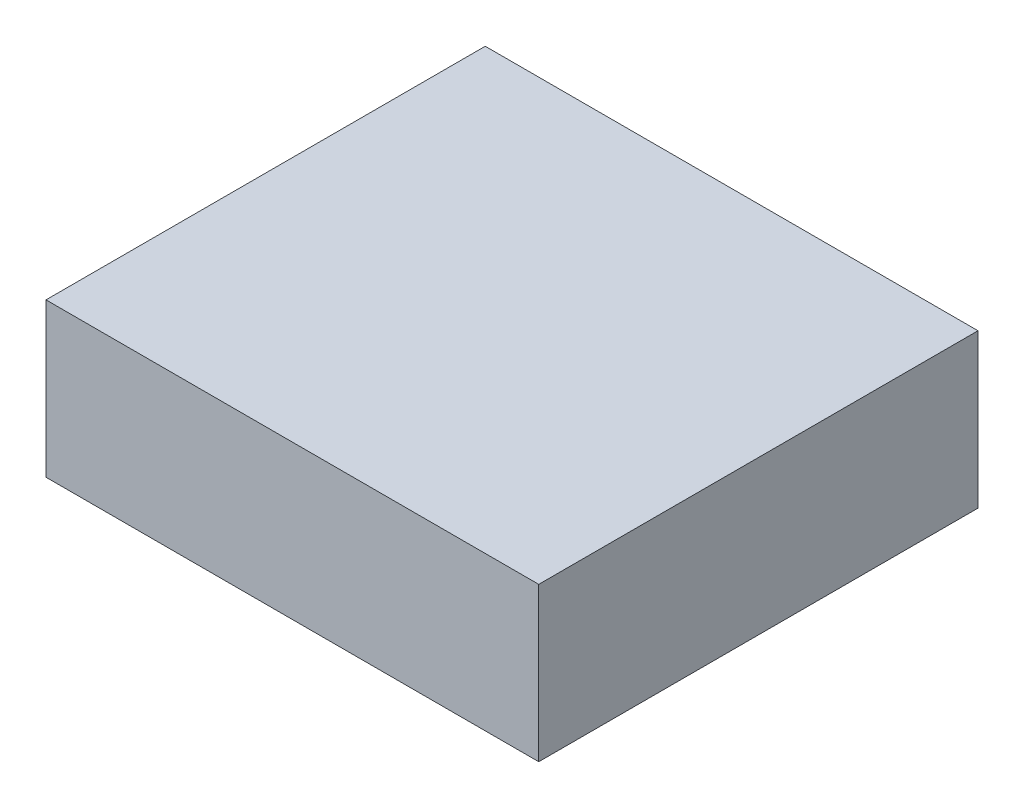
ISO-10303-21;
HEADER;
FILE_DESCRIPTION(('STEP AP214'),'2;1');
FILE_NAME('part.step','',(''),(''),'','','');
FILE_SCHEMA(('AUTOMOTIVE_DESIGN { 1 0 10303 214 1 1 1 1 }'));
ENDSEC;
DATA;
#1=APPLICATION_CONTEXT('core data for automotive mechanical design processes');
#2=APPLICATION_PROTOCOL_DEFINITION('international standard','automotive_design',2000,#1);
#3=PRODUCT_CONTEXT('',#1,'mechanical');
#4=PRODUCT('Part','Part','',(#3));
#5=PRODUCT_RELATED_PRODUCT_CATEGORY('part','',(#4));
#6=PRODUCT_DEFINITION_FORMATION('','',#4);
#7=PRODUCT_DEFINITION_CONTEXT('part definition',#1,'design');
#8=PRODUCT_DEFINITION('design','',#6,#7);
#9=PRODUCT_DEFINITION_SHAPE('','',#8);
#10=(LENGTH_UNIT() NAMED_UNIT(*) SI_UNIT(.MILLI.,.METRE.));
#11=(NAMED_UNIT(*) PLANE_ANGLE_UNIT() SI_UNIT($,.RADIAN.));
#12=(NAMED_UNIT(*) SI_UNIT($,.STERADIAN.) SOLID_ANGLE_UNIT());
#13=UNCERTAINTY_MEASURE_WITH_UNIT(LENGTH_MEASURE(1.E-05),#10,'distance_accuracy_value','');
#14=(GEOMETRIC_REPRESENTATION_CONTEXT(3) GLOBAL_UNCERTAINTY_ASSIGNED_CONTEXT((#13)) GLOBAL_UNIT_ASSIGNED_CONTEXT((#10,
#11,#12)) REPRESENTATION_CONTEXT('',''));
#15=CARTESIAN_POINT('',(0.,0.,0.));
#16=DIRECTION('',(0.,0.,1.));
#17=DIRECTION('',(1.,0.,0.));
#18=AXIS2_PLACEMENT_3D('',#15,#16,#17);
#19=CARTESIAN_POINT('',(-62.4778997860176,39.624,-63.9370439423789));
#20=DIRECTION('',(1.,0.,0.));
#21=DIRECTION('',(0.,0.,-1.));
#22=AXIS2_PLACEMENT_3D('',#19,#20,#21);
#23=PLANE('',#22);
#24=DIRECTION('',(0.,0.,1.));
#25=VECTOR('',#24,1.);
#26=CARTESIAN_POINT('',(-62.4778997860176,0.,-63.9370439423789));
#27=LINE('',#26,#25);
#28=CARTESIAN_POINT('',(-62.4778997860176,0.,-63.9370439423789));
#29=VERTEX_POINT('',#28);
#30=CARTESIAN_POINT('',(-62.4778997860176,0.,49.3456023787655));
#31=VERTEX_POINT('',#30);
#32=EDGE_CURVE('E100',#29,#31,#27,.T.);
#33=ORIENTED_EDGE('',*,*,#32,.T.);
#34=DIRECTION('',(0.,-1.,0.));
#35=VECTOR('',#34,1.);
#36=CARTESIAN_POINT('',(-62.4778997860176,39.624,49.3456023787655));
#37=LINE('',#36,#35);
#38=CARTESIAN_POINT('',(-62.4778997860176,39.624,49.3456023787655));
#39=VERTEX_POINT('',#38);
#40=EDGE_CURVE('E11',#39,#31,#37,.T.);
#41=ORIENTED_EDGE('',*,*,#40,.F.);
#42=DIRECTION('',(0.,0.,1.));
#43=VECTOR('',#42,1.);
#44=CARTESIAN_POINT('',(-62.4778997860176,39.624,-63.9370439423789));
#45=LINE('',#44,#43);
#46=CARTESIAN_POINT('',(-62.4778997860176,39.624,-63.9370439423789));
#47=VERTEX_POINT('',#46);
#48=EDGE_CURVE('E88',#47,#39,#45,.T.);
#49=ORIENTED_EDGE('',*,*,#48,.F.);
#50=DIRECTION('',(0.,-1.,0.));
#51=VECTOR('',#50,1.);
#52=CARTESIAN_POINT('',(-62.4778997860176,39.624,-63.9370439423789));
#53=LINE('',#52,#51);
#54=EDGE_CURVE('E96',#47,#29,#53,.T.);
#55=ORIENTED_EDGE('',*,*,#54,.T.);
#56=EDGE_LOOP('',(#33,#41,#49,#55));
#57=FACE_BOUND('',#56,.T.);
#58=ADVANCED_FACE('F37',(#57),#23,.F.);
#59=CARTESIAN_POINT('',(-62.4778997860176,39.624,49.3456023787655));
#60=DIRECTION('',(0.,0.,-1.));
#61=DIRECTION('',(-1.,0.,0.));
#62=AXIS2_PLACEMENT_3D('',#59,#60,#61);
#63=PLANE('',#62);
#64=DIRECTION('',(1.,0.,0.));
#65=VECTOR('',#64,1.);
#66=CARTESIAN_POINT('',(-62.4778997860176,0.,49.3456023787655));
#67=LINE('',#66,#65);
#68=CARTESIAN_POINT('',(64.6002912861796,0.,49.3456023787655));
#69=VERTEX_POINT('',#68);
#70=EDGE_CURVE('E92',#31,#69,#67,.T.);
#71=ORIENTED_EDGE('',*,*,#70,.T.);
#72=DIRECTION('',(0.,-1.,0.));
#73=VECTOR('',#72,1.);
#74=CARTESIAN_POINT('',(64.6002912861796,39.624,49.3456023787655));
#75=LINE('',#74,#73);
#76=CARTESIAN_POINT('',(64.6002912861796,39.624,49.3456023787655));
#77=VERTEX_POINT('',#76);
#78=EDGE_CURVE('E45',#77,#69,#75,.T.);
#79=ORIENTED_EDGE('',*,*,#78,.F.);
#80=DIRECTION('',(1.,0.,0.));
#81=VECTOR('',#80,1.);
#82=CARTESIAN_POINT('',(-62.4778997860176,39.624,49.3456023787655));
#83=LINE('',#82,#81);
#84=EDGE_CURVE('E83',#39,#77,#83,.T.);
#85=ORIENTED_EDGE('',*,*,#84,.F.);
#86=ORIENTED_EDGE('',*,*,#40,.T.);
#87=EDGE_LOOP('',(#71,#79,#85,#86));
#88=FACE_BOUND('',#87,.T.);
#89=ADVANCED_FACE('F91',(#88),#63,.F.);
#90=CARTESIAN_POINT('',(64.6002912861796,39.624,-63.9370439423789));
#91=DIRECTION('',(-1.,0.,0.));
#92=DIRECTION('',(0.,0.,1.));
#93=AXIS2_PLACEMENT_3D('',#90,#91,#92);
#94=PLANE('',#93);
#95=DIRECTION('',(0.,0.,-1.));
#96=VECTOR('',#95,1.);
#97=CARTESIAN_POINT('',(64.6002912861796,0.,-63.9370439423789));
#98=LINE('',#97,#96);
#99=CARTESIAN_POINT('',(64.6002912861796,0.,-63.9370439423789));
#100=VERTEX_POINT('',#99);
#101=EDGE_CURVE('E70',#69,#100,#98,.T.);
#102=ORIENTED_EDGE('',*,*,#101,.T.);
#103=DIRECTION('',(0.,-1.,0.));
#104=VECTOR('',#103,1.);
#105=CARTESIAN_POINT('',(64.6002912861796,39.624,-63.9370439423789));
#106=LINE('',#105,#104);
#107=CARTESIAN_POINT('',(64.6002912861796,39.624,-63.9370439423789));
#108=VERTEX_POINT('',#107);
#109=EDGE_CURVE('E93',#108,#100,#106,.T.);
#110=ORIENTED_EDGE('',*,*,#109,.F.);
#111=DIRECTION('',(0.,0.,-1.));
#112=VECTOR('',#111,1.);
#113=CARTESIAN_POINT('',(64.6002912861796,39.624,-63.9370439423789));
#114=LINE('',#113,#112);
#115=EDGE_CURVE('E86',#77,#108,#114,.T.);
#116=ORIENTED_EDGE('',*,*,#115,.F.);
#117=ORIENTED_EDGE('',*,*,#78,.T.);
#118=EDGE_LOOP('',(#102,#110,#116,#117));
#119=FACE_BOUND('',#118,.T.);
#120=ADVANCED_FACE('F94',(#119),#94,.F.);
#121=CARTESIAN_POINT('',(-62.4778997860176,39.624,-63.9370439423789));
#122=DIRECTION('',(0.,0.,1.));
#123=DIRECTION('',(1.,0.,0.));
#124=AXIS2_PLACEMENT_3D('',#121,#122,#123);
#125=PLANE('',#124);
#126=DIRECTION('',(-1.,0.,0.));
#127=VECTOR('',#126,1.);
#128=CARTESIAN_POINT('',(-62.4778997860176,0.,-63.9370439423789));
#129=LINE('',#128,#127);
#130=EDGE_CURVE('E76',#100,#29,#129,.T.);
#131=ORIENTED_EDGE('',*,*,#130,.T.);
#132=ORIENTED_EDGE('',*,*,#54,.F.);
#133=DIRECTION('',(-1.,0.,0.));
#134=VECTOR('',#133,1.);
#135=CARTESIAN_POINT('',(-62.4778997860176,39.624,-63.9370439423789));
#136=LINE('',#135,#134);
#137=EDGE_CURVE('E53',#108,#47,#136,.T.);
#138=ORIENTED_EDGE('',*,*,#137,.F.);
#139=ORIENTED_EDGE('',*,*,#109,.T.);
#140=EDGE_LOOP('',(#131,#132,#138,#139));
#141=FACE_BOUND('',#140,.T.);
#142=ADVANCED_FACE('F107',(#141),#125,.F.);
#143=CARTESIAN_POINT('',(0.,39.624,0.));
#144=DIRECTION('',(0.,1.,0.));
#145=DIRECTION('',(0.,0.,1.));
#146=AXIS2_PLACEMENT_3D('',#143,#144,#145);
#147=PLANE('',#146);
#148=ORIENTED_EDGE('',*,*,#48,.T.);
#149=ORIENTED_EDGE('',*,*,#84,.T.);
#150=ORIENTED_EDGE('',*,*,#115,.T.);
#151=ORIENTED_EDGE('',*,*,#137,.T.);
#152=EDGE_LOOP('',(#148,#149,#150,#151));
#153=FACE_BOUND('',#152,.T.);
#154=ADVANCED_FACE('F84',(#153),#147,.T.);
#155=CARTESIAN_POINT('',(0.,0.,0.));
#156=DIRECTION('',(0.,1.,0.));
#157=DIRECTION('',(0.,0.,1.));
#158=AXIS2_PLACEMENT_3D('',#155,#156,#157);
#159=PLANE('',#158);
#160=ORIENTED_EDGE('',*,*,#32,.F.);
#161=ORIENTED_EDGE('',*,*,#130,.F.);
#162=ORIENTED_EDGE('',*,*,#101,.F.);
#163=ORIENTED_EDGE('',*,*,#70,.F.);
#164=EDGE_LOOP('',(#160,#161,#162,#163));
#165=FACE_BOUND('',#164,.T.);
#166=ADVANCED_FACE('F110',(#165),#159,.F.);
#167=CLOSED_SHELL('',(#58,#89,#120,#142,#154,#166));
#168=MANIFOLD_SOLID_BREP('B2',#167);
#169=ADVANCED_BREP_SHAPE_REPRESENTATION('',(#18,#168),#14);
#170=SHAPE_DEFINITION_REPRESENTATION(#9,#169);
ENDSEC;
END-ISO-10303-21;
